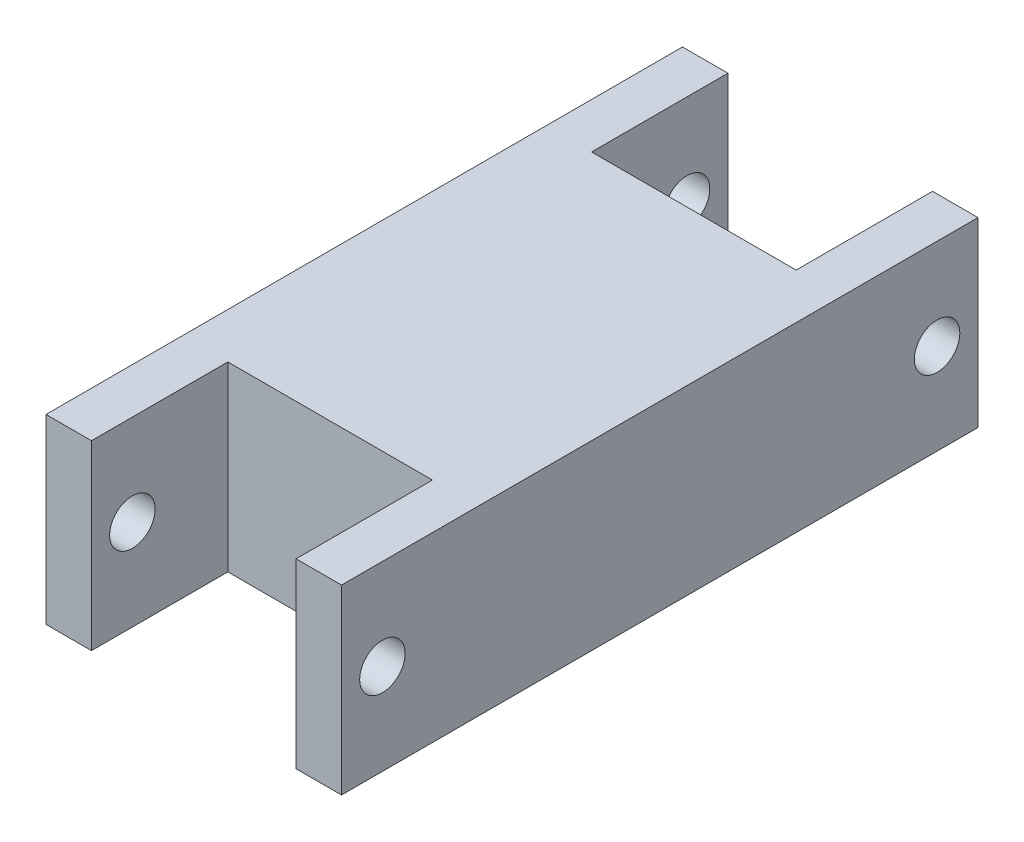
ISO-10303-21;
HEADER;
FILE_DESCRIPTION(('STEP AP214'),'2;1');
FILE_NAME('part.step','',(''),(''),'','','');
FILE_SCHEMA(('AUTOMOTIVE_DESIGN { 1 0 10303 214 1 1 1 1 }'));
ENDSEC;
DATA;
#1=APPLICATION_CONTEXT('core data for automotive mechanical design processes');
#2=APPLICATION_PROTOCOL_DEFINITION('international standard','automotive_design',2000,#1);
#3=PRODUCT_CONTEXT('',#1,'mechanical');
#4=PRODUCT('Part','Part','',(#3));
#5=PRODUCT_RELATED_PRODUCT_CATEGORY('part','',(#4));
#6=PRODUCT_DEFINITION_FORMATION('','',#4);
#7=PRODUCT_DEFINITION_CONTEXT('part definition',#1,'design');
#8=PRODUCT_DEFINITION('design','',#6,#7);
#9=PRODUCT_DEFINITION_SHAPE('','',#8);
#10=(LENGTH_UNIT() NAMED_UNIT(*) SI_UNIT(.MILLI.,.METRE.));
#11=(NAMED_UNIT(*) PLANE_ANGLE_UNIT() SI_UNIT($,.RADIAN.));
#12=(NAMED_UNIT(*) SI_UNIT($,.STERADIAN.) SOLID_ANGLE_UNIT());
#13=UNCERTAINTY_MEASURE_WITH_UNIT(LENGTH_MEASURE(1.E-05),#10,'distance_accuracy_value','');
#14=(GEOMETRIC_REPRESENTATION_CONTEXT(3) GLOBAL_UNCERTAINTY_ASSIGNED_CONTEXT((#13)) GLOBAL_UNIT_ASSIGNED_CONTEXT((#10,
#11,#12)) REPRESENTATION_CONTEXT('',''));
#15=CARTESIAN_POINT('',(0.,0.,0.));
#16=DIRECTION('',(0.,0.,1.));
#17=DIRECTION('',(1.,0.,0.));
#18=AXIS2_PLACEMENT_3D('',#15,#16,#17);
#19=CARTESIAN_POINT('',(22.5,40.,-70.));
#20=DIRECTION('',(0.,0.,1.));
#21=DIRECTION('',(1.,0.,0.));
#22=AXIS2_PLACEMENT_3D('',#19,#20,#21);
#23=PLANE('',#22);
#24=DIRECTION('',(-1.,0.,0.));
#25=VECTOR('',#24,1.);
#26=CARTESIAN_POINT('',(22.5,0.,-70.));
#27=LINE('',#26,#25);
#28=CARTESIAN_POINT('',(32.5,0.,-70.));
#29=VERTEX_POINT('',#28);
#30=CARTESIAN_POINT('',(22.5,0.,-70.));
#31=VERTEX_POINT('',#30);
#32=EDGE_CURVE('E164',#29,#31,#27,.T.);
#33=ORIENTED_EDGE('',*,*,#32,.T.);
#34=DIRECTION('',(0.,-1.,0.));
#35=VECTOR('',#34,1.);
#36=CARTESIAN_POINT('',(22.5,40.,-70.));
#37=LINE('',#36,#35);
#38=CARTESIAN_POINT('',(22.5,40.,-70.));
#39=VERTEX_POINT('',#38);
#40=EDGE_CURVE('E11',#39,#31,#37,.T.);
#41=ORIENTED_EDGE('',*,*,#40,.F.);
#42=DIRECTION('',(-1.,0.,0.));
#43=VECTOR('',#42,1.);
#44=CARTESIAN_POINT('',(22.5,40.,-70.));
#45=LINE('',#44,#43);
#46=CARTESIAN_POINT('',(32.5,40.,-70.));
#47=VERTEX_POINT('',#46);
#48=EDGE_CURVE('E199',#47,#39,#45,.T.);
#49=ORIENTED_EDGE('',*,*,#48,.F.);
#50=DIRECTION('',(0.,-1.,0.));
#51=VECTOR('',#50,1.);
#52=CARTESIAN_POINT('',(32.5,40.,-70.));
#53=LINE('',#52,#51);
#54=EDGE_CURVE('E160',#47,#29,#53,.T.);
#55=ORIENTED_EDGE('',*,*,#54,.T.);
#56=EDGE_LOOP('',(#33,#41,#49,#55));
#57=FACE_BOUND('',#56,.T.);
#58=ADVANCED_FACE('F39',(#57),#23,.F.);
#59=CARTESIAN_POINT('',(22.5,40.,-40.));
#60=DIRECTION('',(1.,0.,0.));
#61=DIRECTION('',(0.,0.,-1.));
#62=AXIS2_PLACEMENT_3D('',#59,#60,#61);
#63=PLANE('',#62);
#64=CARTESIAN_POINT('',(22.5,20.,-61.));
#65=DIRECTION('',(1.,0.,0.));
#66=DIRECTION('',(0.,0.,-1.));
#67=AXIS2_PLACEMENT_3D('',#64,#65,#66);
#68=CIRCLE('',#67,5.00000000000001);
#69=CARTESIAN_POINT('',(22.5,20.,-66.));
#70=VERTEX_POINT('',#69);
#71=EDGE_CURVE('E334',#70,#70,#68,.T.);
#72=ORIENTED_EDGE('',*,*,#71,.T.);
#73=EDGE_LOOP('',(#72));
#74=FACE_BOUND('',#73,.T.);
#75=DIRECTION('',(0.,0.,1.));
#76=VECTOR('',#75,1.);
#77=CARTESIAN_POINT('',(22.5,0.,-40.));
#78=LINE('',#77,#76);
#79=CARTESIAN_POINT('',(22.5,0.,-40.));
#80=VERTEX_POINT('',#79);
#81=EDGE_CURVE('E168',#31,#80,#78,.T.);
#82=ORIENTED_EDGE('',*,*,#81,.T.);
#83=DIRECTION('',(0.,-1.,0.));
#84=VECTOR('',#83,1.);
#85=CARTESIAN_POINT('',(22.5,40.,-40.));
#86=LINE('',#85,#84);
#87=CARTESIAN_POINT('',(22.5,40.,-40.));
#88=VERTEX_POINT('',#87);
#89=EDGE_CURVE('E48',#88,#80,#86,.T.);
#90=ORIENTED_EDGE('',*,*,#89,.F.);
#91=DIRECTION('',(0.,0.,1.));
#92=VECTOR('',#91,1.);
#93=CARTESIAN_POINT('',(22.5,40.,-40.));
#94=LINE('',#93,#92);
#95=EDGE_CURVE('E111',#39,#88,#94,.T.);
#96=ORIENTED_EDGE('',*,*,#95,.F.);
#97=ORIENTED_EDGE('',*,*,#40,.T.);
#98=EDGE_LOOP('',(#82,#90,#96,#97));
#99=FACE_BOUND('',#98,.T.);
#100=ADVANCED_FACE('F296',(#74,#99),#63,.F.);
#101=CARTESIAN_POINT('',(-22.5,40.,-40.));
#102=DIRECTION('',(0.,0.,1.));
#103=DIRECTION('',(1.,0.,0.));
#104=AXIS2_PLACEMENT_3D('',#101,#102,#103);
#105=PLANE('',#104);
#106=DIRECTION('',(-1.,0.,0.));
#107=VECTOR('',#106,1.);
#108=CARTESIAN_POINT('',(-22.5,0.,-40.));
#109=LINE('',#108,#107);
#110=CARTESIAN_POINT('',(-22.5,0.,-40.));
#111=VERTEX_POINT('',#110);
#112=EDGE_CURVE('E172',#80,#111,#109,.T.);
#113=ORIENTED_EDGE('',*,*,#112,.T.);
#114=DIRECTION('',(0.,-1.,0.));
#115=VECTOR('',#114,1.);
#116=CARTESIAN_POINT('',(-22.5,40.,-40.));
#117=LINE('',#116,#115);
#118=CARTESIAN_POINT('',(-22.5,40.,-40.));
#119=VERTEX_POINT('',#118);
#120=EDGE_CURVE('E226',#119,#111,#117,.T.);
#121=ORIENTED_EDGE('',*,*,#120,.F.);
#122=DIRECTION('',(-1.,0.,0.));
#123=VECTOR('',#122,1.);
#124=CARTESIAN_POINT('',(-22.5,40.,-40.));
#125=LINE('',#124,#123);
#126=EDGE_CURVE('E236',#88,#119,#125,.T.);
#127=ORIENTED_EDGE('',*,*,#126,.F.);
#128=ORIENTED_EDGE('',*,*,#89,.T.);
#129=EDGE_LOOP('',(#113,#121,#127,#128));
#130=FACE_BOUND('',#129,.T.);
#131=ADVANCED_FACE('F234',(#130),#105,.F.);
#132=CARTESIAN_POINT('',(-22.5,40.,-70.));
#133=DIRECTION('',(-1.,0.,0.));
#134=DIRECTION('',(0.,0.,1.));
#135=AXIS2_PLACEMENT_3D('',#132,#133,#134);
#136=PLANE('',#135);
#137=CARTESIAN_POINT('',(-22.5,20.,-61.));
#138=DIRECTION('',(-1.,0.,0.));
#139=DIRECTION('',(0.,0.,1.));
#140=AXIS2_PLACEMENT_3D('',#137,#138,#139);
#141=CIRCLE('',#140,5.00000000000001);
#142=CARTESIAN_POINT('',(-22.5,20.,-56.));
#143=VERTEX_POINT('',#142);
#144=EDGE_CURVE('E340',#143,#143,#141,.T.);
#145=ORIENTED_EDGE('',*,*,#144,.T.);
#146=EDGE_LOOP('',(#145));
#147=FACE_BOUND('',#146,.T.);
#148=DIRECTION('',(0.,0.,-1.));
#149=VECTOR('',#148,1.);
#150=CARTESIAN_POINT('',(-22.5,0.,-70.));
#151=LINE('',#150,#149);
#152=CARTESIAN_POINT('',(-22.5,0.,-70.));
#153=VERTEX_POINT('',#152);
#154=EDGE_CURVE('E175',#111,#153,#151,.T.);
#155=ORIENTED_EDGE('',*,*,#154,.T.);
#156=DIRECTION('',(0.,-1.,0.));
#157=VECTOR('',#156,1.);
#158=CARTESIAN_POINT('',(-22.5,40.,-70.));
#159=LINE('',#158,#157);
#160=CARTESIAN_POINT('',(-22.5,40.,-70.));
#161=VERTEX_POINT('',#160);
#162=EDGE_CURVE('E222',#161,#153,#159,.T.);
#163=ORIENTED_EDGE('',*,*,#162,.F.);
#164=DIRECTION('',(0.,0.,-1.));
#165=VECTOR('',#164,1.);
#166=CARTESIAN_POINT('',(-22.5,40.,-70.));
#167=LINE('',#166,#165);
#168=EDGE_CURVE('E255',#119,#161,#167,.T.);
#169=ORIENTED_EDGE('',*,*,#168,.F.);
#170=ORIENTED_EDGE('',*,*,#120,.T.);
#171=EDGE_LOOP('',(#155,#163,#169,#170));
#172=FACE_BOUND('',#171,.T.);
#173=ADVANCED_FACE('F245',(#147,#172),#136,.F.);
#174=CARTESIAN_POINT('',(-32.5,40.,-70.));
#175=DIRECTION('',(0.,0.,1.));
#176=DIRECTION('',(1.,0.,0.));
#177=AXIS2_PLACEMENT_3D('',#174,#175,#176);
#178=PLANE('',#177);
#179=DIRECTION('',(-1.,0.,0.));
#180=VECTOR('',#179,1.);
#181=CARTESIAN_POINT('',(-32.5,0.,-70.));
#182=LINE('',#181,#180);
#183=CARTESIAN_POINT('',(-32.5,0.,-70.));
#184=VERTEX_POINT('',#183);
#185=EDGE_CURVE('E178',#153,#184,#182,.T.);
#186=ORIENTED_EDGE('',*,*,#185,.T.);
#187=DIRECTION('',(0.,-1.,0.));
#188=VECTOR('',#187,1.);
#189=CARTESIAN_POINT('',(-32.5,40.,-70.));
#190=LINE('',#189,#188);
#191=CARTESIAN_POINT('',(-32.5,40.,-70.));
#192=VERTEX_POINT('',#191);
#193=EDGE_CURVE('E218',#192,#184,#190,.T.);
#194=ORIENTED_EDGE('',*,*,#193,.F.);
#195=DIRECTION('',(-1.,0.,0.));
#196=VECTOR('',#195,1.);
#197=CARTESIAN_POINT('',(-32.5,40.,-70.));
#198=LINE('',#197,#196);
#199=EDGE_CURVE('E251',#161,#192,#198,.T.);
#200=ORIENTED_EDGE('',*,*,#199,.F.);
#201=ORIENTED_EDGE('',*,*,#162,.T.);
#202=EDGE_LOOP('',(#186,#194,#200,#201));
#203=FACE_BOUND('',#202,.T.);
#204=ADVANCED_FACE('F249',(#203),#178,.F.);
#205=CARTESIAN_POINT('',(-32.5,40.,70.));
#206=DIRECTION('',(1.,0.,0.));
#207=DIRECTION('',(0.,0.,-1.));
#208=AXIS2_PLACEMENT_3D('',#205,#206,#207);
#209=PLANE('',#208);
#210=CARTESIAN_POINT('',(-32.5,20.,61.));
#211=DIRECTION('',(1.,0.,0.));
#212=DIRECTION('',(0.,0.,-1.));
#213=AXIS2_PLACEMENT_3D('',#210,#211,#212);
#214=CIRCLE('',#213,5.);
#215=CARTESIAN_POINT('',(-32.5,20.,56.));
#216=VERTEX_POINT('',#215);
#217=EDGE_CURVE('E351',#216,#216,#214,.F.);
#218=ORIENTED_EDGE('',*,*,#217,.F.);
#219=EDGE_LOOP('',(#218));
#220=FACE_BOUND('',#219,.T.);
#221=CARTESIAN_POINT('',(-32.5,20.,-61.));
#222=DIRECTION('',(1.,0.,0.));
#223=DIRECTION('',(0.,0.,-1.));
#224=AXIS2_PLACEMENT_3D('',#221,#222,#223);
#225=CIRCLE('',#224,5.00000000000001);
#226=CARTESIAN_POINT('',(-32.5,20.,-66.));
#227=VERTEX_POINT('',#226);
#228=EDGE_CURVE('E352',#227,#227,#225,.F.);
#229=ORIENTED_EDGE('',*,*,#228,.F.);
#230=EDGE_LOOP('',(#229));
#231=FACE_BOUND('',#230,.T.);
#232=DIRECTION('',(0.,0.,1.));
#233=VECTOR('',#232,1.);
#234=CARTESIAN_POINT('',(-32.5,0.,70.));
#235=LINE('',#234,#233);
#236=CARTESIAN_POINT('',(-32.5,0.,70.));
#237=VERTEX_POINT('',#236);
#238=EDGE_CURVE('E181',#184,#237,#235,.T.);
#239=ORIENTED_EDGE('',*,*,#238,.T.);
#240=DIRECTION('',(0.,-1.,0.));
#241=VECTOR('',#240,1.);
#242=CARTESIAN_POINT('',(-32.5,40.,70.));
#243=LINE('',#242,#241);
#244=CARTESIAN_POINT('',(-32.5,40.,70.));
#245=VERTEX_POINT('',#244);
#246=EDGE_CURVE('E214',#245,#237,#243,.T.);
#247=ORIENTED_EDGE('',*,*,#246,.F.);
#248=DIRECTION('',(0.,0.,1.));
#249=VECTOR('',#248,1.);
#250=CARTESIAN_POINT('',(-32.5,40.,70.));
#251=LINE('',#250,#249);
#252=EDGE_CURVE('E254',#192,#245,#251,.T.);
#253=ORIENTED_EDGE('',*,*,#252,.F.);
#254=ORIENTED_EDGE('',*,*,#193,.T.);
#255=EDGE_LOOP('',(#239,#247,#253,#254));
#256=FACE_BOUND('',#255,.T.);
#257=ADVANCED_FACE('F312',(#220,#231,#256),#209,.F.);
#258=CARTESIAN_POINT('',(-32.5,40.,70.));
#259=DIRECTION('',(0.,0.,-1.));
#260=DIRECTION('',(-1.,0.,0.));
#261=AXIS2_PLACEMENT_3D('',#258,#259,#260);
#262=PLANE('',#261);
#263=DIRECTION('',(1.,0.,0.));
#264=VECTOR('',#263,1.);
#265=CARTESIAN_POINT('',(-32.5,0.,70.));
#266=LINE('',#265,#264);
#267=CARTESIAN_POINT('',(-22.5,0.,70.));
#268=VERTEX_POINT('',#267);
#269=EDGE_CURVE('E184',#237,#268,#266,.T.);
#270=ORIENTED_EDGE('',*,*,#269,.T.);
#271=DIRECTION('',(0.,-1.,0.));
#272=VECTOR('',#271,1.);
#273=CARTESIAN_POINT('',(-22.5,40.,70.));
#274=LINE('',#273,#272);
#275=CARTESIAN_POINT('',(-22.5,40.,70.));
#276=VERTEX_POINT('',#275);
#277=EDGE_CURVE('E210',#276,#268,#274,.T.);
#278=ORIENTED_EDGE('',*,*,#277,.F.);
#279=DIRECTION('',(1.,0.,0.));
#280=VECTOR('',#279,1.);
#281=CARTESIAN_POINT('',(-32.5,40.,70.));
#282=LINE('',#281,#280);
#283=EDGE_CURVE('E259',#245,#276,#282,.T.);
#284=ORIENTED_EDGE('',*,*,#283,.F.);
#285=ORIENTED_EDGE('',*,*,#246,.T.);
#286=EDGE_LOOP('',(#270,#278,#284,#285));
#287=FACE_BOUND('',#286,.T.);
#288=ADVANCED_FACE('F315',(#287),#262,.F.);
#289=CARTESIAN_POINT('',(-22.5,40.,70.));
#290=DIRECTION('',(-1.,0.,0.));
#291=DIRECTION('',(0.,0.,1.));
#292=AXIS2_PLACEMENT_3D('',#289,#290,#291);
#293=PLANE('',#292);
#294=CARTESIAN_POINT('',(-22.5,20.,61.));
#295=DIRECTION('',(-1.,0.,0.));
#296=DIRECTION('',(0.,0.,1.));
#297=AXIS2_PLACEMENT_3D('',#294,#295,#296);
#298=CIRCLE('',#297,5.);
#299=CARTESIAN_POINT('',(-22.5,20.,66.));
#300=VERTEX_POINT('',#299);
#301=EDGE_CURVE('E169',#300,#300,#298,.T.);
#302=ORIENTED_EDGE('',*,*,#301,.T.);
#303=EDGE_LOOP('',(#302));
#304=FACE_BOUND('',#303,.T.);
#305=DIRECTION('',(0.,0.,-1.));
#306=VECTOR('',#305,1.);
#307=CARTESIAN_POINT('',(-22.5,0.,70.));
#308=LINE('',#307,#306);
#309=CARTESIAN_POINT('',(-22.5,0.,40.));
#310=VERTEX_POINT('',#309);
#311=EDGE_CURVE('E187',#268,#310,#308,.T.);
#312=ORIENTED_EDGE('',*,*,#311,.T.);
#313=DIRECTION('',(0.,-1.,0.));
#314=VECTOR('',#313,1.);
#315=CARTESIAN_POINT('',(-22.5,40.,40.));
#316=LINE('',#315,#314);
#317=CARTESIAN_POINT('',(-22.5,40.,40.));
#318=VERTEX_POINT('',#317);
#319=EDGE_CURVE('E206',#318,#310,#316,.T.);
#320=ORIENTED_EDGE('',*,*,#319,.F.);
#321=DIRECTION('',(0.,0.,-1.));
#322=VECTOR('',#321,1.);
#323=CARTESIAN_POINT('',(-22.5,40.,70.));
#324=LINE('',#323,#322);
#325=EDGE_CURVE('E266',#276,#318,#324,.T.);
#326=ORIENTED_EDGE('',*,*,#325,.F.);
#327=ORIENTED_EDGE('',*,*,#277,.T.);
#328=EDGE_LOOP('',(#312,#320,#326,#327));
#329=FACE_BOUND('',#328,.T.);
#330=ADVANCED_FACE('F274',(#304,#329),#293,.F.);
#331=CARTESIAN_POINT('',(-22.5,40.,40.));
#332=DIRECTION('',(0.,0.,-1.));
#333=DIRECTION('',(-1.,0.,0.));
#334=AXIS2_PLACEMENT_3D('',#331,#332,#333);
#335=PLANE('',#334);
#336=DIRECTION('',(1.,0.,0.));
#337=VECTOR('',#336,1.);
#338=CARTESIAN_POINT('',(-22.5,0.,40.));
#339=LINE('',#338,#337);
#340=CARTESIAN_POINT('',(22.5,0.,40.));
#341=VERTEX_POINT('',#340);
#342=EDGE_CURVE('E190',#310,#341,#339,.T.);
#343=ORIENTED_EDGE('',*,*,#342,.T.);
#344=DIRECTION('',(0.,-1.,0.));
#345=VECTOR('',#344,1.);
#346=CARTESIAN_POINT('',(22.5,40.,40.));
#347=LINE('',#346,#345);
#348=CARTESIAN_POINT('',(22.5,40.,40.));
#349=VERTEX_POINT('',#348);
#350=EDGE_CURVE('E153',#349,#341,#347,.T.);
#351=ORIENTED_EDGE('',*,*,#350,.F.);
#352=DIRECTION('',(1.,0.,0.));
#353=VECTOR('',#352,1.);
#354=CARTESIAN_POINT('',(-22.5,40.,40.));
#355=LINE('',#354,#353);
#356=EDGE_CURVE('E142',#318,#349,#355,.T.);
#357=ORIENTED_EDGE('',*,*,#356,.F.);
#358=ORIENTED_EDGE('',*,*,#319,.T.);
#359=EDGE_LOOP('',(#343,#351,#357,#358));
#360=FACE_BOUND('',#359,.T.);
#361=ADVANCED_FACE('F278',(#360),#335,.F.);
#362=CARTESIAN_POINT('',(22.5,40.,40.));
#363=DIRECTION('',(1.,0.,0.));
#364=DIRECTION('',(0.,0.,-1.));
#365=AXIS2_PLACEMENT_3D('',#362,#363,#364);
#366=PLANE('',#365);
#367=CARTESIAN_POINT('',(22.5,20.,61.));
#368=DIRECTION('',(1.,0.,0.));
#369=DIRECTION('',(0.,0.,-1.));
#370=AXIS2_PLACEMENT_3D('',#367,#368,#369);
#371=CIRCLE('',#370,5.);
#372=CARTESIAN_POINT('',(22.5,20.,56.));
#373=VERTEX_POINT('',#372);
#374=EDGE_CURVE('E331',#373,#373,#371,.T.);
#375=ORIENTED_EDGE('',*,*,#374,.T.);
#376=EDGE_LOOP('',(#375));
#377=FACE_BOUND('',#376,.T.);
#378=DIRECTION('',(0.,0.,1.));
#379=VECTOR('',#378,1.);
#380=CARTESIAN_POINT('',(22.5,0.,40.));
#381=LINE('',#380,#379);
#382=CARTESIAN_POINT('',(22.5,0.,70.));
#383=VERTEX_POINT('',#382);
#384=EDGE_CURVE('E151',#341,#383,#381,.T.);
#385=ORIENTED_EDGE('',*,*,#384,.T.);
#386=DIRECTION('',(0.,-1.,0.));
#387=VECTOR('',#386,1.);
#388=CARTESIAN_POINT('',(22.5,40.,70.));
#389=LINE('',#388,#387);
#390=CARTESIAN_POINT('',(22.5,40.,70.));
#391=VERTEX_POINT('',#390);
#392=EDGE_CURVE('E148',#391,#383,#389,.T.);
#393=ORIENTED_EDGE('',*,*,#392,.F.);
#394=DIRECTION('',(0.,0.,1.));
#395=VECTOR('',#394,1.);
#396=CARTESIAN_POINT('',(22.5,40.,40.));
#397=LINE('',#396,#395);
#398=EDGE_CURVE('E136',#349,#391,#397,.T.);
#399=ORIENTED_EDGE('',*,*,#398,.F.);
#400=ORIENTED_EDGE('',*,*,#350,.T.);
#401=EDGE_LOOP('',(#385,#393,#399,#400));
#402=FACE_BOUND('',#401,.T.);
#403=ADVANCED_FACE('F149',(#377,#402),#366,.F.);
#404=CARTESIAN_POINT('',(22.5,40.,70.));
#405=DIRECTION('',(0.,0.,-1.));
#406=DIRECTION('',(-1.,0.,0.));
#407=AXIS2_PLACEMENT_3D('',#404,#405,#406);
#408=PLANE('',#407);
#409=DIRECTION('',(1.,0.,0.));
#410=VECTOR('',#409,1.);
#411=CARTESIAN_POINT('',(22.5,0.,70.));
#412=LINE('',#411,#410);
#413=CARTESIAN_POINT('',(32.5,0.,70.));
#414=VERTEX_POINT('',#413);
#415=EDGE_CURVE('E97',#383,#414,#412,.T.);
#416=ORIENTED_EDGE('',*,*,#415,.T.);
#417=DIRECTION('',(0.,-1.,0.));
#418=VECTOR('',#417,1.);
#419=CARTESIAN_POINT('',(32.5,40.,70.));
#420=LINE('',#419,#418);
#421=CARTESIAN_POINT('',(32.5,40.,70.));
#422=VERTEX_POINT('',#421);
#423=EDGE_CURVE('E154',#422,#414,#420,.T.);
#424=ORIENTED_EDGE('',*,*,#423,.F.);
#425=DIRECTION('',(1.,0.,0.));
#426=VECTOR('',#425,1.);
#427=CARTESIAN_POINT('',(22.5,40.,70.));
#428=LINE('',#427,#426);
#429=EDGE_CURVE('E140',#391,#422,#428,.T.);
#430=ORIENTED_EDGE('',*,*,#429,.F.);
#431=ORIENTED_EDGE('',*,*,#392,.T.);
#432=EDGE_LOOP('',(#416,#424,#430,#431));
#433=FACE_BOUND('',#432,.T.);
#434=ADVANCED_FACE('F156',(#433),#408,.F.);
#435=CARTESIAN_POINT('',(32.5,40.,70.));
#436=DIRECTION('',(-1.,0.,0.));
#437=DIRECTION('',(0.,0.,1.));
#438=AXIS2_PLACEMENT_3D('',#435,#436,#437);
#439=PLANE('',#438);
#440=CARTESIAN_POINT('',(32.5,20.,61.));
#441=DIRECTION('',(1.,0.,0.));
#442=DIRECTION('',(0.,0.,-1.));
#443=AXIS2_PLACEMENT_3D('',#440,#441,#442);
#444=CIRCLE('',#443,5.);
#445=CARTESIAN_POINT('',(32.5,20.,56.));
#446=VERTEX_POINT('',#445);
#447=EDGE_CURVE('E356',#446,#446,#444,.T.);
#448=ORIENTED_EDGE('',*,*,#447,.F.);
#449=EDGE_LOOP('',(#448));
#450=FACE_BOUND('',#449,.T.);
#451=CARTESIAN_POINT('',(32.5,20.,-61.));
#452=DIRECTION('',(1.,0.,0.));
#453=DIRECTION('',(0.,0.,-1.));
#454=AXIS2_PLACEMENT_3D('',#451,#452,#453);
#455=CIRCLE('',#454,5.00000000000001);
#456=CARTESIAN_POINT('',(32.5,20.,-66.));
#457=VERTEX_POINT('',#456);
#458=EDGE_CURVE('E357',#457,#457,#455,.T.);
#459=ORIENTED_EDGE('',*,*,#458,.F.);
#460=EDGE_LOOP('',(#459));
#461=FACE_BOUND('',#460,.T.);
#462=DIRECTION('',(0.,0.,-1.));
#463=VECTOR('',#462,1.);
#464=CARTESIAN_POINT('',(32.5,0.,70.));
#465=LINE('',#464,#463);
#466=EDGE_CURVE('E103',#414,#29,#465,.T.);
#467=ORIENTED_EDGE('',*,*,#466,.T.);
#468=ORIENTED_EDGE('',*,*,#54,.F.);
#469=DIRECTION('',(0.,0.,-1.));
#470=VECTOR('',#469,1.);
#471=CARTESIAN_POINT('',(32.5,40.,70.));
#472=LINE('',#471,#470);
#473=EDGE_CURVE('E56',#422,#47,#472,.T.);
#474=ORIENTED_EDGE('',*,*,#473,.F.);
#475=ORIENTED_EDGE('',*,*,#423,.T.);
#476=EDGE_LOOP('',(#467,#468,#474,#475));
#477=FACE_BOUND('',#476,.T.);
#478=ADVANCED_FACE('F282',(#450,#461,#477),#439,.F.);
#479=CARTESIAN_POINT('',(0.,40.,0.));
#480=DIRECTION('',(0.,1.,0.));
#481=DIRECTION('',(0.,0.,1.));
#482=AXIS2_PLACEMENT_3D('',#479,#480,#481);
#483=PLANE('',#482);
#484=ORIENTED_EDGE('',*,*,#48,.T.);
#485=ORIENTED_EDGE('',*,*,#95,.T.);
#486=ORIENTED_EDGE('',*,*,#126,.T.);
#487=ORIENTED_EDGE('',*,*,#168,.T.);
#488=ORIENTED_EDGE('',*,*,#199,.T.);
#489=ORIENTED_EDGE('',*,*,#252,.T.);
#490=ORIENTED_EDGE('',*,*,#283,.T.);
#491=ORIENTED_EDGE('',*,*,#325,.T.);
#492=ORIENTED_EDGE('',*,*,#356,.T.);
#493=ORIENTED_EDGE('',*,*,#398,.T.);
#494=ORIENTED_EDGE('',*,*,#429,.T.);
#495=ORIENTED_EDGE('',*,*,#473,.T.);
#496=EDGE_LOOP('',(#484,#485,#486,#487,#488,#489,#490,#491,#492,#493,#494,#495));
#497=FACE_BOUND('',#496,.T.);
#498=ADVANCED_FACE('F138',(#497),#483,.T.);
#499=CARTESIAN_POINT('',(0.,0.,0.));
#500=DIRECTION('',(0.,1.,0.));
#501=DIRECTION('',(0.,0.,1.));
#502=AXIS2_PLACEMENT_3D('',#499,#500,#501);
#503=PLANE('',#502);
#504=ORIENTED_EDGE('',*,*,#32,.F.);
#505=ORIENTED_EDGE('',*,*,#466,.F.);
#506=ORIENTED_EDGE('',*,*,#415,.F.);
#507=ORIENTED_EDGE('',*,*,#384,.F.);
#508=ORIENTED_EDGE('',*,*,#342,.F.);
#509=ORIENTED_EDGE('',*,*,#311,.F.);
#510=ORIENTED_EDGE('',*,*,#269,.F.);
#511=ORIENTED_EDGE('',*,*,#238,.F.);
#512=ORIENTED_EDGE('',*,*,#185,.F.);
#513=ORIENTED_EDGE('',*,*,#154,.F.);
#514=ORIENTED_EDGE('',*,*,#112,.F.);
#515=ORIENTED_EDGE('',*,*,#81,.F.);
#516=EDGE_LOOP('',(#504,#505,#506,#507,#508,#509,#510,#511,#512,#513,#514,#515));
#517=FACE_BOUND('',#516,.T.);
#518=ADVANCED_FACE('F240',(#517),#503,.F.);
#519=CARTESIAN_POINT('',(-46.642135623731,20.,-61.));
#520=DIRECTION('',(1.,0.,0.));
#521=DIRECTION('',(0.,0.,-1.));
#522=AXIS2_PLACEMENT_3D('',#519,#520,#521);
#523=CYLINDRICAL_SURFACE('',#522,5.00000000000001);
#524=ORIENTED_EDGE('',*,*,#458,.T.);
#525=EDGE_LOOP('',(#524));
#526=FACE_BOUND('',#525,.T.);
#527=ORIENTED_EDGE('',*,*,#71,.F.);
#528=EDGE_LOOP('',(#527));
#529=FACE_BOUND('',#528,.T.);
#530=ADVANCED_FACE('F370',(#526,#529),#523,.F.);
#531=CARTESIAN_POINT('',(-46.642135623731,20.,61.));
#532=DIRECTION('',(1.,0.,0.));
#533=DIRECTION('',(0.,0.,-1.));
#534=AXIS2_PLACEMENT_3D('',#531,#532,#533);
#535=CYLINDRICAL_SURFACE('',#534,5.);
#536=ORIENTED_EDGE('',*,*,#447,.T.);
#537=EDGE_LOOP('',(#536));
#538=FACE_BOUND('',#537,.T.);
#539=ORIENTED_EDGE('',*,*,#374,.F.);
#540=EDGE_LOOP('',(#539));
#541=FACE_BOUND('',#540,.T.);
#542=ADVANCED_FACE('F367',(#538,#541),#535,.F.);
#543=ORIENTED_EDGE('',*,*,#217,.T.);
#544=EDGE_LOOP('',(#543));
#545=FACE_BOUND('',#544,.T.);
#546=ORIENTED_EDGE('',*,*,#301,.F.);
#547=EDGE_LOOP('',(#546));
#548=FACE_BOUND('',#547,.T.);
#549=ADVANCED_FACE('F369',(#545,#548),#535,.F.);
#550=ORIENTED_EDGE('',*,*,#228,.T.);
#551=EDGE_LOOP('',(#550));
#552=FACE_BOUND('',#551,.T.);
#553=ORIENTED_EDGE('',*,*,#144,.F.);
#554=EDGE_LOOP('',(#553));
#555=FACE_BOUND('',#554,.T.);
#556=ADVANCED_FACE('F376',(#552,#555),#523,.F.);
#557=CLOSED_SHELL('',(#58,#100,#131,#173,#204,#257,#288,#330,#361,#403,#434,#478,#498,#518,#530,
#542,#549,#556));
#558=MANIFOLD_SOLID_BREP('B2',#557);
#559=ADVANCED_BREP_SHAPE_REPRESENTATION('',(#18,#558),#14);
#560=SHAPE_DEFINITION_REPRESENTATION(#9,#559);
ENDSEC;
END-ISO-10303-21;
